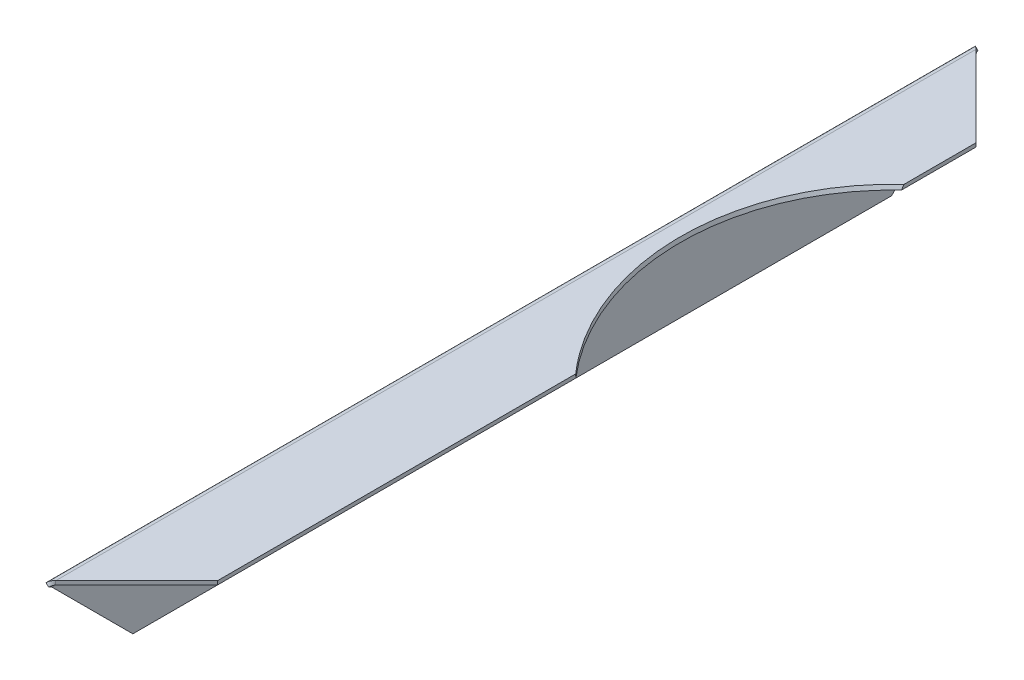
ISO-10303-21;
HEADER;
FILE_DESCRIPTION(('STEP AP214'),'2;1');
FILE_NAME('part.step','',(''),(''),'','','');
FILE_SCHEMA(('AUTOMOTIVE_DESIGN { 1 0 10303 214 1 1 1 1 }'));
ENDSEC;
DATA;
#1=APPLICATION_CONTEXT('core data for automotive mechanical design processes');
#2=APPLICATION_PROTOCOL_DEFINITION('international standard','automotive_design',2000,#1);
#3=PRODUCT_CONTEXT('',#1,'mechanical');
#4=PRODUCT('Part','Part','',(#3));
#5=PRODUCT_RELATED_PRODUCT_CATEGORY('part','',(#4));
#6=PRODUCT_DEFINITION_FORMATION('','',#4);
#7=PRODUCT_DEFINITION_CONTEXT('part definition',#1,'design');
#8=PRODUCT_DEFINITION('design','',#6,#7);
#9=PRODUCT_DEFINITION_SHAPE('','',#8);
#10=(LENGTH_UNIT() NAMED_UNIT(*) SI_UNIT(.MILLI.,.METRE.));
#11=(NAMED_UNIT(*) PLANE_ANGLE_UNIT() SI_UNIT($,.RADIAN.));
#12=(NAMED_UNIT(*) SI_UNIT($,.STERADIAN.) SOLID_ANGLE_UNIT());
#13=UNCERTAINTY_MEASURE_WITH_UNIT(LENGTH_MEASURE(1.E-05),#10,'distance_accuracy_value','');
#14=(GEOMETRIC_REPRESENTATION_CONTEXT(3) GLOBAL_UNCERTAINTY_ASSIGNED_CONTEXT((#13)) GLOBAL_UNIT_ASSIGNED_CONTEXT((#10,
#11,#12)) REPRESENTATION_CONTEXT('',''));
#15=CARTESIAN_POINT('',(0.,0.,0.));
#16=DIRECTION('',(0.,0.,1.));
#17=DIRECTION('',(1.,0.,0.));
#18=AXIS2_PLACEMENT_3D('',#15,#16,#17);
#19=CARTESIAN_POINT('',(-75.1616434307379,91.8897069999997,74.9733070000015));
#20=DIRECTION('',(-1.,0.,0.));
#21=DIRECTION('',(0.,0.,-1.));
#22=AXIS2_PLACEMENT_3D('',#19,#20,#21);
#23=PLANE('',#22);
#24=DIRECTION('',(0.,0.,1.));
#25=VECTOR('',#24,1.);
#26=CARTESIAN_POINT('',(-75.1616434307379,91.8897069999997,74.9733070000015));
#27=LINE('',#26,#25);
#28=CARTESIAN_POINT('',(-75.1616434307379,91.8897069999997,4.1560197362018));
#29=VERTEX_POINT('',#28);
#30=CARTESIAN_POINT('',(-75.1616434307379,91.8897069999997,74.9733070000015));
#31=VERTEX_POINT('',#30);
#32=EDGE_CURVE('E132',#29,#31,#27,.T.);
#33=ORIENTED_EDGE('',*,*,#32,.F.);
#34=CARTESIAN_POINT('',(-75.1616434307382,190.664589075125,-58.6395736622189));
#35=DIRECTION('',(-1.,0.,0.));
#36=DIRECTION('',(0.,-0.944747526340175,0.32779888876279));
#37=AXIS2_PLACEMENT_3D('',#34,#35,#36);
#38=ELLIPSE('',#37,143.222737959914,44.45);
#39=CARTESIAN_POINT('',(-75.1616434307379,92.6263069999997,4.19275809097225));
#40=VERTEX_POINT('',#39);
#41=EDGE_CURVE('E121',#29,#40,#38,.T.);
#42=ORIENTED_EDGE('',*,*,#41,.T.);
#43=DIRECTION('',(0.,0.,1.));
#44=VECTOR('',#43,1.);
#45=CARTESIAN_POINT('',(-75.1616434307379,92.6263069999997,74.9733070000015));
#46=LINE('',#45,#44);
#47=CARTESIAN_POINT('',(-75.1616434307379,92.6263069999997,74.9733070000015));
#48=VERTEX_POINT('',#47);
#49=EDGE_CURVE('E130',#40,#48,#46,.T.);
#50=ORIENTED_EDGE('',*,*,#49,.T.);
#51=DIRECTION('',(0.,1.,0.));
#52=VECTOR('',#51,1.);
#53=CARTESIAN_POINT('',(-75.1616434307379,91.8897069999997,74.9733070000015));
#54=LINE('',#53,#52);
#55=EDGE_CURVE('E249',#31,#48,#54,.T.);
#56=ORIENTED_EDGE('',*,*,#55,.F.);
#57=EDGE_LOOP('',(#33,#42,#50,#56));
#58=FACE_BOUND('',#57,.T.);
#59=ADVANCED_FACE('F32',(#58),#23,.F.);
#60=CARTESIAN_POINT('',(-92.6263069999994,0.18833643072165,0.));
#61=DIRECTION('',(-1.,0.,0.));
#62=DIRECTION('',(0.,0.,1.));
#63=AXIS2_PLACEMENT_3D('',#60,#61,#62);
#64=PLANE('',#63);
#65=DIRECTION('',(0.,-0.707106781186615,-0.70710678118648));
#66=VECTOR('',#65,1.);
#67=CARTESIAN_POINT('',(-92.6263070000001,92.0208934307375,91.8325569999984));
#68=LINE('',#67,#66);
#69=CARTESIAN_POINT('',(-92.6263070000001,91.1531069999997,90.9647705692607));
#70=VERTEX_POINT('',#69);
#71=CARTESIAN_POINT('',(-92.626307,75.1616434307375,74.9733070000015));
#72=VERTEX_POINT('',#71);
#73=EDGE_CURVE('E55',#70,#72,#68,.T.);
#74=ORIENTED_EDGE('',*,*,#73,.F.);
#75=DIRECTION('',(0.,0.,-1.));
#76=VECTOR('',#75,1.);
#77=CARTESIAN_POINT('',(-92.6263070000001,91.1531069999997,0.));
#78=LINE('',#77,#76);
#79=CARTESIAN_POINT('',(-92.626307,91.1531069999997,-90.9647705692606));
#80=VERTEX_POINT('',#79);
#81=EDGE_CURVE('E239',#70,#80,#78,.T.);
#82=ORIENTED_EDGE('',*,*,#81,.T.);
#83=DIRECTION('',(0.,0.707106781186615,-0.70710678118648));
#84=VECTOR('',#83,1.);
#85=CARTESIAN_POINT('',(-92.6263070000001,92.0208934307375,-91.8325569999983));
#86=LINE('',#85,#84);
#87=CARTESIAN_POINT('',(-92.626307,75.1616434307375,-74.9733070000015));
#88=VERTEX_POINT('',#87);
#89=EDGE_CURVE('E211',#88,#80,#86,.T.);
#90=ORIENTED_EDGE('',*,*,#89,.F.);
#91=DIRECTION('',(0.,0.,-1.));
#92=VECTOR('',#91,1.);
#93=CARTESIAN_POINT('',(-92.626307,75.1616434307375,74.9733070000015));
#94=LINE('',#93,#92);
#95=EDGE_CURVE('E209',#72,#88,#94,.T.);
#96=ORIENTED_EDGE('',*,*,#95,.F.);
#97=EDGE_LOOP('',(#74,#82,#90,#96));
#98=FACE_BOUND('',#97,.T.);
#99=ADVANCED_FACE('F270',(#98),#64,.T.);
#100=CARTESIAN_POINT('',(-91.8897070000001,92.0208934307375,91.8325569999984));
#101=DIRECTION('',(0.,0.70710678118648,-0.707106781186615));
#102=DIRECTION('',(0.,0.707106781186615,0.70710678118648));
#103=AXIS2_PLACEMENT_3D('',#100,#101,#102);
#104=PLANE('',#103);
#105=CARTESIAN_POINT('',(-92.626307,91.1531069999996,90.9647705692607));
#106=CARTESIAN_POINT('',(-91.889707,91.1531069999997,90.9647705692607));
#107=B_SPLINE_CURVE_WITH_KNOTS('',1,(#105,#106),.UNSPECIFIED.,.F.,.F.,(2,2),(0.,1.),.UNSPECIFIED.);
#108=CARTESIAN_POINT('',(-91.8897070000001,91.1531069999997,90.9647705692607));
#109=VERTEX_POINT('',#108);
#110=EDGE_CURVE('E41',#70,#109,#107,.T.);
#111=ORIENTED_EDGE('',*,*,#110,.F.);
#112=ORIENTED_EDGE('',*,*,#73,.T.);
#113=DIRECTION('',(-1.,0.,0.));
#114=VECTOR('',#113,1.);
#115=CARTESIAN_POINT('',(-91.889707,75.1616434307375,74.9733070000015));
#116=LINE('',#115,#114);
#117=CARTESIAN_POINT('',(-91.889707,75.1616434307375,74.9733070000015));
#118=VERTEX_POINT('',#117);
#119=EDGE_CURVE('E215',#118,#72,#116,.T.);
#120=ORIENTED_EDGE('',*,*,#119,.F.);
#121=DIRECTION('',(0.,-0.707106781186615,-0.70710678118648));
#122=VECTOR('',#121,1.);
#123=CARTESIAN_POINT('',(-91.8897070000001,92.0208934307375,91.8325569999984));
#124=LINE('',#123,#122);
#125=EDGE_CURVE('E208',#109,#118,#124,.T.);
#126=ORIENTED_EDGE('',*,*,#125,.F.);
#127=EDGE_LOOP('',(#111,#112,#120,#126));
#128=FACE_BOUND('',#127,.T.);
#129=ADVANCED_FACE('F34',(#128),#104,.F.);
#130=CARTESIAN_POINT('',(-91.889707,75.1616434307375,74.9733070000015));
#131=DIRECTION('',(0.,1.,0.));
#132=DIRECTION('',(0.,0.,1.));
#133=AXIS2_PLACEMENT_3D('',#130,#131,#132);
#134=PLANE('',#133);
#135=ORIENTED_EDGE('',*,*,#95,.T.);
#136=DIRECTION('',(-1.,0.,0.));
#137=VECTOR('',#136,1.);
#138=CARTESIAN_POINT('',(-91.8897069999999,75.1616434307375,-74.9733070000015));
#139=LINE('',#138,#137);
#140=CARTESIAN_POINT('',(-91.8897069999999,75.1616434307375,-74.9733070000015));
#141=VERTEX_POINT('',#140);
#142=EDGE_CURVE('E212',#141,#88,#139,.T.);
#143=ORIENTED_EDGE('',*,*,#142,.F.);
#144=DIRECTION('',(0.,0.,-1.));
#145=VECTOR('',#144,1.);
#146=CARTESIAN_POINT('',(-91.889707,75.1616434307375,74.9733070000015));
#147=LINE('',#146,#145);
#148=EDGE_CURVE('E205',#118,#141,#147,.T.);
#149=ORIENTED_EDGE('',*,*,#148,.F.);
#150=ORIENTED_EDGE('',*,*,#119,.T.);
#151=EDGE_LOOP('',(#135,#143,#149,#150));
#152=FACE_BOUND('',#151,.T.);
#153=ADVANCED_FACE('F187',(#152),#134,.F.);
#154=CARTESIAN_POINT('',(-91.8897070000001,92.0208934307376,-91.8325569999983));
#155=DIRECTION('',(0.,0.70710678118648,0.707106781186615));
#156=DIRECTION('',(0.,-0.707106781186615,0.70710678118648));
#157=AXIS2_PLACEMENT_3D('',#154,#155,#156);
#158=PLANE('',#157);
#159=CARTESIAN_POINT('',(-91.889707,91.1531069999997,-90.9647705692606));
#160=CARTESIAN_POINT('',(-92.626307,91.1531069999996,-90.9647705692606));
#161=B_SPLINE_CURVE_WITH_KNOTS('',1,(#159,#160),.UNSPECIFIED.,.F.,.F.,(2,2),(0.,1.),.UNSPECIFIED.);
#162=CARTESIAN_POINT('',(-91.889707,91.1531069999997,-90.9647705692606));
#163=VERTEX_POINT('',#162);
#164=EDGE_CURVE('E225',#163,#80,#161,.T.);
#165=ORIENTED_EDGE('',*,*,#164,.F.);
#166=DIRECTION('',(0.,0.707106781186615,-0.70710678118648));
#167=VECTOR('',#166,1.);
#168=CARTESIAN_POINT('',(-91.8897070000001,92.0208934307376,-91.8325569999983));
#169=LINE('',#168,#167);
#170=EDGE_CURVE('E207',#141,#163,#169,.T.);
#171=ORIENTED_EDGE('',*,*,#170,.F.);
#172=ORIENTED_EDGE('',*,*,#142,.T.);
#173=ORIENTED_EDGE('',*,*,#89,.T.);
#174=EDGE_LOOP('',(#165,#171,#172,#173));
#175=FACE_BOUND('',#174,.T.);
#176=ADVANCED_FACE('F261',(#175),#158,.F.);
#177=CARTESIAN_POINT('',(-91.8897069999994,0.18833643072165,0.));
#178=DIRECTION('',(-1.,0.,0.));
#179=DIRECTION('',(0.,0.,1.));
#180=AXIS2_PLACEMENT_3D('',#177,#178,#179);
#181=PLANE('',#180);
#182=DIRECTION('',(0.,0.,-1.));
#183=VECTOR('',#182,1.);
#184=CARTESIAN_POINT('',(-91.8897070000001,91.1531069999997,0.));
#185=LINE('',#184,#183);
#186=EDGE_CURVE('E218',#109,#163,#185,.T.);
#187=ORIENTED_EDGE('',*,*,#186,.F.);
#188=ORIENTED_EDGE('',*,*,#125,.T.);
#189=ORIENTED_EDGE('',*,*,#148,.T.);
#190=ORIENTED_EDGE('',*,*,#170,.T.);
#191=EDGE_LOOP('',(#187,#188,#189,#190));
#192=FACE_BOUND('',#191,.T.);
#193=ADVANCED_FACE('F269',(#192),#181,.F.);
#194=CARTESIAN_POINT('',(-75.1616434307379,92.6263069999997,-74.9733070000015));
#195=VERTEX_POINT('',#194);
#196=CARTESIAN_POINT('',(-75.1616434307379,92.6263069999997,-60.6969433163674));
#197=VERTEX_POINT('',#196);
#198=EDGE_CURVE('E140',#195,#197,#46,.T.);
#199=ORIENTED_EDGE('',*,*,#198,.T.);
#200=CARTESIAN_POINT('',(-75.1616434307379,91.8897069999997,-60.2035788749848));
#201=VERTEX_POINT('',#200);
#202=EDGE_CURVE('E47',#197,#201,#38,.T.);
#203=ORIENTED_EDGE('',*,*,#202,.T.);
#204=CARTESIAN_POINT('',(-75.1616434307379,91.8897069999997,-74.9733070000015));
#205=VERTEX_POINT('',#204);
#206=EDGE_CURVE('E295',#205,#201,#27,.T.);
#207=ORIENTED_EDGE('',*,*,#206,.F.);
#208=DIRECTION('',(0.,1.,0.));
#209=VECTOR('',#208,1.);
#210=CARTESIAN_POINT('',(-75.1616434307379,91.8897069999997,-74.9733070000015));
#211=LINE('',#210,#209);
#212=EDGE_CURVE('E143',#205,#195,#211,.T.);
#213=ORIENTED_EDGE('',*,*,#212,.T.);
#214=EDGE_LOOP('',(#199,#203,#207,#213));
#215=FACE_BOUND('',#214,.T.);
#216=ADVANCED_FACE('F276',(#215),#23,.F.);
#217=CARTESIAN_POINT('',(-183.853450430754,91.8897069999994,0.));
#218=DIRECTION('',(0.,1.,0.));
#219=DIRECTION('',(0.,0.,1.));
#220=AXIS2_PLACEMENT_3D('',#217,#218,#219);
#221=PLANE('',#220);
#222=ORIENTED_EDGE('',*,*,#206,.T.);
#223=CARTESIAN_POINT('',(-41.0279423850872,91.8897069999998,-24.3676696040725));
#224=DIRECTION('',(0.,1.,0.));
#225=DIRECTION('',(0.705676740389851,0.,0.708533935724151));
#226=AXIS2_PLACEMENT_3D('',#223,#224,#225);
#227=ELLIPSE('',#226,49.4935758743306,44.45);
#228=EDGE_CURVE('E133',#201,#29,#227,.T.);
#229=ORIENTED_EDGE('',*,*,#228,.T.);
#230=ORIENTED_EDGE('',*,*,#32,.T.);
#231=DIRECTION('',(-0.707106781186614,0.,0.707106781186481));
#232=VECTOR('',#231,1.);
#233=CARTESIAN_POINT('',(-92.0208934307379,91.8897069999997,91.8325569999984));
#234=LINE('',#233,#232);
#235=CARTESIAN_POINT('',(-91.153107,91.8897069999997,90.9647705692607));
#236=VERTEX_POINT('',#235);
#237=EDGE_CURVE('E294',#31,#236,#234,.T.);
#238=ORIENTED_EDGE('',*,*,#237,.T.);
#239=DIRECTION('',(0.,0.,-1.));
#240=VECTOR('',#239,1.);
#241=CARTESIAN_POINT('',(-91.153107,91.8897069999997,0.));
#242=LINE('',#241,#240);
#243=CARTESIAN_POINT('',(-91.153107,91.8897069999997,-90.9647705692606));
#244=VERTEX_POINT('',#243);
#245=EDGE_CURVE('E165',#236,#244,#242,.T.);
#246=ORIENTED_EDGE('',*,*,#245,.T.);
#247=DIRECTION('',(0.707106781186614,0.,0.707106781186481));
#248=VECTOR('',#247,1.);
#249=CARTESIAN_POINT('',(-92.0208934307379,91.8897069999997,-91.8325569999983));
#250=LINE('',#249,#248);
#251=EDGE_CURVE('E293',#244,#205,#250,.T.);
#252=ORIENTED_EDGE('',*,*,#251,.T.);
#253=EDGE_LOOP('',(#222,#229,#230,#238,#246,#252));
#254=FACE_BOUND('',#253,.T.);
#255=ADVANCED_FACE('F177',(#254),#221,.F.);
#256=CARTESIAN_POINT('',(-92.0208934307379,91.8897069999997,-91.8325569999983));
#257=DIRECTION('',(-0.707106781186481,0.,0.707106781186614));
#258=DIRECTION('',(-0.707106781186614,0.,-0.707106781186481));
#259=AXIS2_PLACEMENT_3D('',#256,#257,#258);
#260=PLANE('',#259);
#261=ORIENTED_EDGE('',*,*,#251,.F.);
#262=CARTESIAN_POINT('',(-91.153107,92.6263069999997,-90.9647705692606));
#263=CARTESIAN_POINT('',(-91.153107,91.8897069999997,-90.9647705692606));
#264=B_SPLINE_CURVE_WITH_KNOTS('',1,(#262,#263),.UNSPECIFIED.,.F.,.F.,(2,2),(0.,1.),.UNSPECIFIED.);
#265=CARTESIAN_POINT('',(-91.153107,92.6263069999997,-90.9647705692606));
#266=VERTEX_POINT('',#265);
#267=EDGE_CURVE('E154',#244,#266,#264,.F.);
#268=ORIENTED_EDGE('',*,*,#267,.T.);
#269=DIRECTION('',(0.707106781186614,0.,0.707106781186481));
#270=VECTOR('',#269,1.);
#271=CARTESIAN_POINT('',(-92.0208934307379,92.6263069999997,-91.8325569999983));
#272=LINE('',#271,#270);
#273=EDGE_CURVE('E152',#266,#195,#272,.T.);
#274=ORIENTED_EDGE('',*,*,#273,.T.);
#275=ORIENTED_EDGE('',*,*,#212,.F.);
#276=EDGE_LOOP('',(#261,#268,#274,#275));
#277=FACE_BOUND('',#276,.T.);
#278=ADVANCED_FACE('F167',(#277),#260,.F.);
#279=CARTESIAN_POINT('',(-183.853450430754,92.6263069999994,0.));
#280=DIRECTION('',(0.,1.,0.));
#281=DIRECTION('',(0.,0.,1.));
#282=AXIS2_PLACEMENT_3D('',#279,#280,#281);
#283=PLANE('',#282);
#284=CARTESIAN_POINT('',(-41.2824897321658,92.6263069999999,-24.6232475809718));
#285=DIRECTION('',(0.,1.,0.));
#286=DIRECTION('',(0.705676740389851,0.,0.708533935724151));
#287=AXIS2_PLACEMENT_3D('',#284,#285,#286);
#288=ELLIPSE('',#287,49.4935758743306,44.45);
#289=EDGE_CURVE('E11',#197,#40,#288,.T.);
#290=ORIENTED_EDGE('',*,*,#289,.F.);
#291=ORIENTED_EDGE('',*,*,#198,.F.);
#292=ORIENTED_EDGE('',*,*,#273,.F.);
#293=DIRECTION('',(0.,0.,-1.));
#294=VECTOR('',#293,1.);
#295=CARTESIAN_POINT('',(-91.153107,92.6263069999997,0.));
#296=LINE('',#295,#294);
#297=CARTESIAN_POINT('',(-91.153107,92.6263069999997,90.9647705692607));
#298=VERTEX_POINT('',#297);
#299=EDGE_CURVE('E141',#298,#266,#296,.T.);
#300=ORIENTED_EDGE('',*,*,#299,.F.);
#301=DIRECTION('',(-0.707106781186614,0.,0.707106781186481));
#302=VECTOR('',#301,1.);
#303=CARTESIAN_POINT('',(-92.0208934307379,92.6263069999997,91.8325569999984));
#304=LINE('',#303,#302);
#305=EDGE_CURVE('E139',#48,#298,#304,.T.);
#306=ORIENTED_EDGE('',*,*,#305,.F.);
#307=ORIENTED_EDGE('',*,*,#49,.F.);
#308=EDGE_LOOP('',(#290,#291,#292,#300,#306,#307));
#309=FACE_BOUND('',#308,.T.);
#310=ADVANCED_FACE('F136',(#309),#283,.T.);
#311=CARTESIAN_POINT('',(-92.0208934307379,91.8897069999997,91.8325569999984));
#312=DIRECTION('',(-0.707106781186481,0.,-0.707106781186614));
#313=DIRECTION('',(0.707106781186614,0.,-0.707106781186481));
#314=AXIS2_PLACEMENT_3D('',#311,#312,#313);
#315=PLANE('',#314);
#316=ORIENTED_EDGE('',*,*,#305,.T.);
#317=CARTESIAN_POINT('',(-91.153107,91.8897069999997,90.9647705692607));
#318=CARTESIAN_POINT('',(-91.153107,92.6263069999997,90.9647705692607));
#319=B_SPLINE_CURVE_WITH_KNOTS('',1,(#317,#318),.UNSPECIFIED.,.F.,.F.,(2,2),(0.,1.),.UNSPECIFIED.);
#320=EDGE_CURVE('E202',#298,#236,#319,.F.);
#321=ORIENTED_EDGE('',*,*,#320,.T.);
#322=ORIENTED_EDGE('',*,*,#237,.F.);
#323=ORIENTED_EDGE('',*,*,#55,.T.);
#324=EDGE_LOOP('',(#316,#321,#322,#323));
#325=FACE_BOUND('',#324,.T.);
#326=ADVANCED_FACE('F181',(#325),#315,.F.);
#327=CARTESIAN_POINT('',(-92.1948167100441,92.1948167100437,91.8325569999984));
#328=CARTESIAN_POINT('',(-92.3311919267768,92.0584414933109,91.6879092391921));
#329=CARTESIAN_POINT('',(-92.4403691073235,91.895038481882,91.5432948564191));
#330=CARTESIAN_POINT('',(-92.5879635472678,91.5387139832377,91.2540327128399));
#331=CARTESIAN_POINT('',(-92.626307,91.3459706810746,91.1094183300669));
#332=CARTESIAN_POINT('',(-92.626307,91.1531069999996,90.9647705692607));
#333=CARTESIAN_POINT('',(-91.6739618550221,91.6739618550217,91.8325569999984));
#334=CARTESIAN_POINT('',(-91.7421453784557,91.6057783315881,91.6879179046431));
#335=CARTESIAN_POINT('',(-91.7967380536618,91.5240727409409,91.5432948564191));
#336=CARTESIAN_POINT('',(-91.8705352736339,91.3459104916187,91.2540327128399));
#337=CARTESIAN_POINT('',(-91.889707,91.2495330635698,91.109409664616));
#338=CARTESIAN_POINT('',(-91.889707,91.1531069999997,90.9647705692607));
#339=B_SPLINE_SURFACE_WITH_KNOTS('',1,3,((#327,#328,#329,#330,#331,#332),(#333,#334,#335,#336,
#337,#338)),.UNSPECIFIED.,.F.,.F.,.F.,(2,2),(4,2,4),(0.,1.),(0.,0.5,1.),.UNSPECIFIED.);
#340=CARTESIAN_POINT('',(-92.1948167100441,92.1948167100437,91.8325569999983));
#341=CARTESIAN_POINT('',(-91.6739618550221,91.6739618550217,91.8325569999983));
#342=B_SPLINE_CURVE_WITH_KNOTS('',1,(#340,#341),.UNSPECIFIED.,.F.,.F.,(2,2),(0.,1.),.UNSPECIFIED.);
#343=CARTESIAN_POINT('',(-92.1948169457465,92.1948164743412,91.8325567499982));
#344=VERTEX_POINT('',#343);
#345=CARTESIAN_POINT('',(-91.6739618550221,91.6739618550217,91.8325569999984));
#346=VERTEX_POINT('',#345);
#347=EDGE_CURVE('E145',#344,#346,#342,.T.);
#348=CARTESIAN_POINT('',(-92.1948167100441,92.1948167100437,91.8325569999984));
#349=CARTESIAN_POINT('',(-92.3311919267768,92.0584414933109,91.6879092391921));
#350=CARTESIAN_POINT('',(-92.4403691073235,91.895038481882,91.5432948564191));
#351=CARTESIAN_POINT('',(-92.5879635472678,91.5387139832377,91.2540327128399));
#352=CARTESIAN_POINT('',(-92.626307,91.3459706810746,91.1094183300669));
#353=CARTESIAN_POINT('',(-92.626307,91.1531069999996,90.9647705692607));
#354=B_SPLINE_CURVE_WITH_KNOTS('',3,(#348,#349,#350,#351,#352,#353),.UNSPECIFIED.,.F.,.F.,(4,2,
4),(0.,0.5,1.),.UNSPECIFIED.);
#355=EDGE_CURVE('E360',#344,#70,#354,.T.);
#356=CARTESIAN_POINT('',(-91.889707,91.1531069999997,90.9647705692607));
#357=CARTESIAN_POINT('',(-91.889707,91.2495330635698,91.109409664616));
#358=CARTESIAN_POINT('',(-91.8705352736339,91.3459104916187,91.2540327128399));
#359=CARTESIAN_POINT('',(-91.7967380536618,91.5240727409409,91.5432948564191));
#360=CARTESIAN_POINT('',(-91.7421453784557,91.6057783315881,91.6879179046431));
#361=CARTESIAN_POINT('',(-91.6739618550221,91.6739618550217,91.8325569999984));
#362=B_SPLINE_CURVE_WITH_KNOTS('',3,(#356,#357,#358,#359,#360,#361),.UNSPECIFIED.,.F.,.F.,(4,2,
4),(0.,0.5,1.),.UNSPECIFIED.);
#363=EDGE_CURVE('E363',#346,#109,#362,.F.);
#364=ORIENTED_EDGE('',*,*,#347,.F.);
#365=ORIENTED_EDGE('',*,*,#355,.T.);
#366=ORIENTED_EDGE('',*,*,#110,.T.);
#367=ORIENTED_EDGE('',*,*,#363,.F.);
#368=EDGE_LOOP('',(#364,#365,#366,#367));
#369=FACE_BOUND('',#368,.T.);
#370=ADVANCED_FACE('F185',(#369),#339,.F.);
#371=CARTESIAN_POINT('',(-92.626307,91.1531069999996,-90.9647705692606));
#372=CARTESIAN_POINT('',(-92.626307,91.3459706810746,-91.1094183300668));
#373=CARTESIAN_POINT('',(-92.5879635472678,91.5387139832378,-91.2540327128399));
#374=CARTESIAN_POINT('',(-92.4403691073235,91.8950384818821,-91.5432948564191));
#375=CARTESIAN_POINT('',(-92.3311919267768,92.058441493311,-91.6879092391921));
#376=CARTESIAN_POINT('',(-92.1948167100441,92.1948167100437,-91.8325569999983));
#377=CARTESIAN_POINT('',(-91.889707,91.1531069999997,-90.9647705692606));
#378=CARTESIAN_POINT('',(-91.889707,91.2495330635699,-91.109409664616));
#379=CARTESIAN_POINT('',(-91.8705352736339,91.3459104916187,-91.2540327128399));
#380=CARTESIAN_POINT('',(-91.7967380536618,91.5240727409409,-91.5432948564191));
#381=CARTESIAN_POINT('',(-91.7421453784557,91.605778331588,-91.687917904643));
#382=CARTESIAN_POINT('',(-91.673961855022,91.6739618550217,-91.8325569999983));
#383=B_SPLINE_SURFACE_WITH_KNOTS('',1,3,((#371,#372,#373,#374,#375,#376),(#377,#378,#379,#380,
#381,#382)),.UNSPECIFIED.,.F.,.F.,.F.,(2,2),(4,2,4),(0.,1.),(0.,0.5,1.),.UNSPECIFIED.);
#384=CARTESIAN_POINT('',(-92.626307,91.1531069999996,-90.9647705692606));
#385=CARTESIAN_POINT('',(-92.626307,91.3459706810746,-91.1094183300668));
#386=CARTESIAN_POINT('',(-92.5879635472678,91.5387139832378,-91.2540327128399));
#387=CARTESIAN_POINT('',(-92.4403691073235,91.8950384818821,-91.5432948564191));
#388=CARTESIAN_POINT('',(-92.3311919267768,92.058441493311,-91.6879092391921));
#389=CARTESIAN_POINT('',(-92.1948167100441,92.1948167100437,-91.8325569999983));
#390=B_SPLINE_CURVE_WITH_KNOTS('',3,(#384,#385,#386,#387,#388,#389),.UNSPECIFIED.,.F.,.F.,(4,2,
4),(0.,0.5,1.),.UNSPECIFIED.);
#391=CARTESIAN_POINT('',(-92.1948169457464,92.1948164743413,-91.8325567499982));
#392=VERTEX_POINT('',#391);
#393=EDGE_CURVE('E375',#80,#392,#390,.T.);
#394=CARTESIAN_POINT('',(-92.1948167100441,92.1948167100437,-91.8325569999983));
#395=CARTESIAN_POINT('',(-91.673961855022,91.6739618550217,-91.8325569999983));
#396=B_SPLINE_CURVE_WITH_KNOTS('',1,(#394,#395),.UNSPECIFIED.,.F.,.F.,(2,2),(0.,1.),.UNSPECIFIED.);
#397=CARTESIAN_POINT('',(-91.673961855022,91.6739618550217,-91.8325569999983));
#398=VERTEX_POINT('',#397);
#399=EDGE_CURVE('E368',#392,#398,#396,.T.);
#400=CARTESIAN_POINT('',(-91.673961855022,91.6739618550217,-91.8325569999983));
#401=CARTESIAN_POINT('',(-91.7421453784557,91.605778331588,-91.687917904643));
#402=CARTESIAN_POINT('',(-91.7967380536618,91.5240727409409,-91.5432948564191));
#403=CARTESIAN_POINT('',(-91.8705352736339,91.3459104916187,-91.2540327128399));
#404=CARTESIAN_POINT('',(-91.889707,91.2495330635699,-91.109409664616));
#405=CARTESIAN_POINT('',(-91.889707,91.1531069999997,-90.9647705692606));
#406=B_SPLINE_CURVE_WITH_KNOTS('',3,(#400,#401,#402,#403,#404,#405),.UNSPECIFIED.,.F.,.F.,(4,2,
4),(0.,0.5,1.),.UNSPECIFIED.);
#407=EDGE_CURVE('E379',#163,#398,#406,.F.);
#408=ORIENTED_EDGE('',*,*,#164,.T.);
#409=ORIENTED_EDGE('',*,*,#393,.T.);
#410=ORIENTED_EDGE('',*,*,#399,.T.);
#411=ORIENTED_EDGE('',*,*,#407,.F.);
#412=EDGE_LOOP('',(#408,#409,#410,#411));
#413=FACE_BOUND('',#412,.T.);
#414=ADVANCED_FACE('F386',(#413),#383,.F.);
#415=CARTESIAN_POINT('',(-92.1948167100441,92.1948167100437,-91.8325569999983));
#416=CARTESIAN_POINT('',(-92.0584414933113,92.3311919267765,-91.6879092391921));
#417=CARTESIAN_POINT('',(-91.8950384818824,92.4403691073232,-91.5432948564191));
#418=CARTESIAN_POINT('',(-91.5387139832381,92.5879635472675,-91.2540327128399));
#419=CARTESIAN_POINT('',(-91.345970681075,92.6263069999997,-91.1094183300668));
#420=CARTESIAN_POINT('',(-91.153107,92.6263069999997,-90.9647705692606));
#421=CARTESIAN_POINT('',(-91.673961855022,91.6739618550217,-91.8325569999983));
#422=CARTESIAN_POINT('',(-91.6057783315884,91.7421453784553,-91.687917904643));
#423=CARTESIAN_POINT('',(-91.5240727409412,91.7967380536614,-91.5432948564191));
#424=CARTESIAN_POINT('',(-91.3459104916191,91.8705352736336,-91.2540327128399));
#425=CARTESIAN_POINT('',(-91.2495330635702,91.8897069999997,-91.1094096646159));
#426=CARTESIAN_POINT('',(-91.153107,91.8897069999997,-90.9647705692606));
#427=B_SPLINE_SURFACE_WITH_KNOTS('',1,3,((#415,#416,#417,#418,#419,#420),(#421,#422,#423,#424,
#425,#426)),.UNSPECIFIED.,.F.,.F.,.F.,(2,2),(4,2,4),(0.,1.),(0.,0.5,1.),.UNSPECIFIED.);
#428=CARTESIAN_POINT('',(-92.1948167100441,92.1948167100437,-91.8325569999983));
#429=CARTESIAN_POINT('',(-92.0584414933113,92.3311919267765,-91.6879092391921));
#430=CARTESIAN_POINT('',(-91.8950384818824,92.4403691073232,-91.5432948564191));
#431=CARTESIAN_POINT('',(-91.5387139832381,92.5879635472675,-91.2540327128399));
#432=CARTESIAN_POINT('',(-91.345970681075,92.6263069999997,-91.1094183300668));
#433=CARTESIAN_POINT('',(-91.153107,92.6263069999997,-90.9647705692606));
#434=B_SPLINE_CURVE_WITH_KNOTS('',3,(#428,#429,#430,#431,#432,#433),.UNSPECIFIED.,.F.,.F.,(4,2,
4),(0.,0.5,1.),.UNSPECIFIED.);
#435=EDGE_CURVE('E378',#392,#266,#434,.T.);
#436=CARTESIAN_POINT('',(-91.153107,91.8897069999997,-90.9647705692606));
#437=CARTESIAN_POINT('',(-91.2495330635702,91.8897069999997,-91.1094096646159));
#438=CARTESIAN_POINT('',(-91.3459104916191,91.8705352736336,-91.2540327128399));
#439=CARTESIAN_POINT('',(-91.5240727409412,91.7967380536614,-91.5432948564191));
#440=CARTESIAN_POINT('',(-91.6057783315884,91.7421453784553,-91.687917904643));
#441=CARTESIAN_POINT('',(-91.673961855022,91.6739618550217,-91.8325569999983));
#442=B_SPLINE_CURVE_WITH_KNOTS('',3,(#436,#437,#438,#439,#440,#441),.UNSPECIFIED.,.F.,.F.,(4,2,
4),(0.,0.5,1.),.UNSPECIFIED.);
#443=EDGE_CURVE('E493',#398,#244,#442,.F.);
#444=ORIENTED_EDGE('',*,*,#399,.F.);
#445=ORIENTED_EDGE('',*,*,#435,.T.);
#446=ORIENTED_EDGE('',*,*,#267,.F.);
#447=ORIENTED_EDGE('',*,*,#443,.F.);
#448=EDGE_LOOP('',(#444,#445,#446,#447));
#449=FACE_BOUND('',#448,.T.);
#450=ADVANCED_FACE('F314',(#449),#427,.F.);
#451=CARTESIAN_POINT('',(-91.153107,92.6263069999997,90.9647705692607));
#452=CARTESIAN_POINT('',(-91.345970681075,92.6263069999997,91.1094183300669));
#453=CARTESIAN_POINT('',(-91.5387139832381,92.5879635472674,91.2540327128399));
#454=CARTESIAN_POINT('',(-91.8950384818825,92.4403691073231,91.5432948564191));
#455=CARTESIAN_POINT('',(-92.0584414933113,92.3311919267764,91.6879092391921));
#456=CARTESIAN_POINT('',(-92.1948167100441,92.1948167100437,91.8325569999983));
#457=CARTESIAN_POINT('',(-91.153107,91.8897069999997,90.9647705692607));
#458=CARTESIAN_POINT('',(-91.2495330635703,91.8897069999997,91.109409664616));
#459=CARTESIAN_POINT('',(-91.3459104916191,91.8705352736335,91.2540327128399));
#460=CARTESIAN_POINT('',(-91.5240727409413,91.7967380536614,91.5432948564191));
#461=CARTESIAN_POINT('',(-91.6057783315885,91.7421453784553,91.6879179046431));
#462=CARTESIAN_POINT('',(-91.6739618550221,91.6739618550217,91.8325569999983));
#463=B_SPLINE_SURFACE_WITH_KNOTS('',1,3,((#451,#452,#453,#454,#455,#456),(#457,#458,#459,#460,
#461,#462)),.UNSPECIFIED.,.F.,.F.,.F.,(2,2),(4,2,4),(0.,1.),(0.,0.5,1.),.UNSPECIFIED.);
#464=CARTESIAN_POINT('',(-91.153107,92.6263069999997,90.9647705692607));
#465=CARTESIAN_POINT('',(-91.345970681075,92.6263069999997,91.1094183300669));
#466=CARTESIAN_POINT('',(-91.5387139832381,92.5879635472674,91.2540327128399));
#467=CARTESIAN_POINT('',(-91.8950384818825,92.4403691073231,91.5432948564191));
#468=CARTESIAN_POINT('',(-92.0584414933113,92.3311919267764,91.6879092391921));
#469=CARTESIAN_POINT('',(-92.1948167100441,92.1948167100437,91.8325569999983));
#470=B_SPLINE_CURVE_WITH_KNOTS('',3,(#464,#465,#466,#467,#468,#469),.UNSPECIFIED.,.F.,.F.,(4,2,
4),(0.,0.5,1.),.UNSPECIFIED.);
#471=EDGE_CURVE('E372',#298,#344,#470,.T.);
#472=CARTESIAN_POINT('',(-91.6739618550221,91.6739618550217,91.8325569999983));
#473=CARTESIAN_POINT('',(-91.6057783315885,91.7421453784553,91.6879179046431));
#474=CARTESIAN_POINT('',(-91.5240727409413,91.7967380536614,91.5432948564191));
#475=CARTESIAN_POINT('',(-91.3459104916191,91.8705352736335,91.2540327128399));
#476=CARTESIAN_POINT('',(-91.2495330635703,91.8897069999997,91.109409664616));
#477=CARTESIAN_POINT('',(-91.153107,91.8897069999997,90.9647705692607));
#478=B_SPLINE_CURVE_WITH_KNOTS('',3,(#472,#473,#474,#475,#476,#477),.UNSPECIFIED.,.F.,.F.,(4,2,
4),(0.,0.5,1.),.UNSPECIFIED.);
#479=EDGE_CURVE('E462',#236,#346,#478,.F.);
#480=ORIENTED_EDGE('',*,*,#471,.T.);
#481=ORIENTED_EDGE('',*,*,#347,.T.);
#482=ORIENTED_EDGE('',*,*,#479,.F.);
#483=ORIENTED_EDGE('',*,*,#320,.F.);
#484=EDGE_LOOP('',(#480,#481,#482,#483));
#485=FACE_BOUND('',#484,.T.);
#486=ADVANCED_FACE('F302',(#485),#463,.F.);
#487=CARTESIAN_POINT('',(-91.153107,91.1531069999996,183.674791121017));
#488=DIRECTION('',(0.,0.,-1.));
#489=DIRECTION('',(1.,0.,0.));
#490=AXIS2_PLACEMENT_3D('',#487,#488,#489);
#491=CYLINDRICAL_SURFACE('',#490,0.7366);
#492=ORIENTED_EDGE('',*,*,#245,.F.);
#493=ORIENTED_EDGE('',*,*,#479,.T.);
#494=ORIENTED_EDGE('',*,*,#363,.T.);
#495=ORIENTED_EDGE('',*,*,#186,.T.);
#496=ORIENTED_EDGE('',*,*,#407,.T.);
#497=ORIENTED_EDGE('',*,*,#443,.T.);
#498=EDGE_LOOP('',(#492,#493,#494,#495,#496,#497));
#499=FACE_BOUND('',#498,.T.);
#500=ADVANCED_FACE('F313',(#499),#491,.F.);
#501=CARTESIAN_POINT('',(-91.153107,91.1531069999996,183.674791121017));
#502=DIRECTION('',(0.,0.,-1.));
#503=DIRECTION('',(1.,0.,0.));
#504=AXIS2_PLACEMENT_3D('',#501,#502,#503);
#505=CYLINDRICAL_SURFACE('',#504,1.4732);
#506=ORIENTED_EDGE('',*,*,#299,.T.);
#507=ORIENTED_EDGE('',*,*,#435,.F.);
#508=ORIENTED_EDGE('',*,*,#393,.F.);
#509=ORIENTED_EDGE('',*,*,#81,.F.);
#510=ORIENTED_EDGE('',*,*,#355,.F.);
#511=ORIENTED_EDGE('',*,*,#471,.F.);
#512=EDGE_LOOP('',(#506,#507,#508,#509,#510,#511));
#513=FACE_BOUND('',#512,.T.);
#514=ADVANCED_FACE('F316',(#513),#505,.T.);
#515=CARTESIAN_POINT('',(-52.729250277345,125.750532863469,-36.1163546031575));
#516=DIRECTION('',(0.310355748208371,-0.898096353208812,0.311612339144416));
#517=DIRECTION('',(0.,-0.32779888876279,-0.944747526340175));
#518=AXIS2_PLACEMENT_3D('',#515,#516,#517);
#519=CYLINDRICAL_SURFACE('',#518,44.45);
#520=ORIENTED_EDGE('',*,*,#202,.F.);
#521=ORIENTED_EDGE('',*,*,#289,.T.);
#522=ORIENTED_EDGE('',*,*,#41,.F.);
#523=ORIENTED_EDGE('',*,*,#228,.F.);
#524=EDGE_LOOP('',(#520,#521,#522,#523));
#525=FACE_BOUND('',#524,.T.);
#526=ADVANCED_FACE('F120',(#525),#519,.F.);
#527=CLOSED_SHELL('',(#59,#99,#129,#153,#176,#193,#216,#255,#278,#310,#326,#370,#414,#450,#486,
#500,#514,#526));
#528=MANIFOLD_SOLID_BREP('B2',#527);
#529=ADVANCED_BREP_SHAPE_REPRESENTATION('',(#18,#528),#14);
#530=SHAPE_DEFINITION_REPRESENTATION(#9,#529);
ENDSEC;
END-ISO-10303-21;
